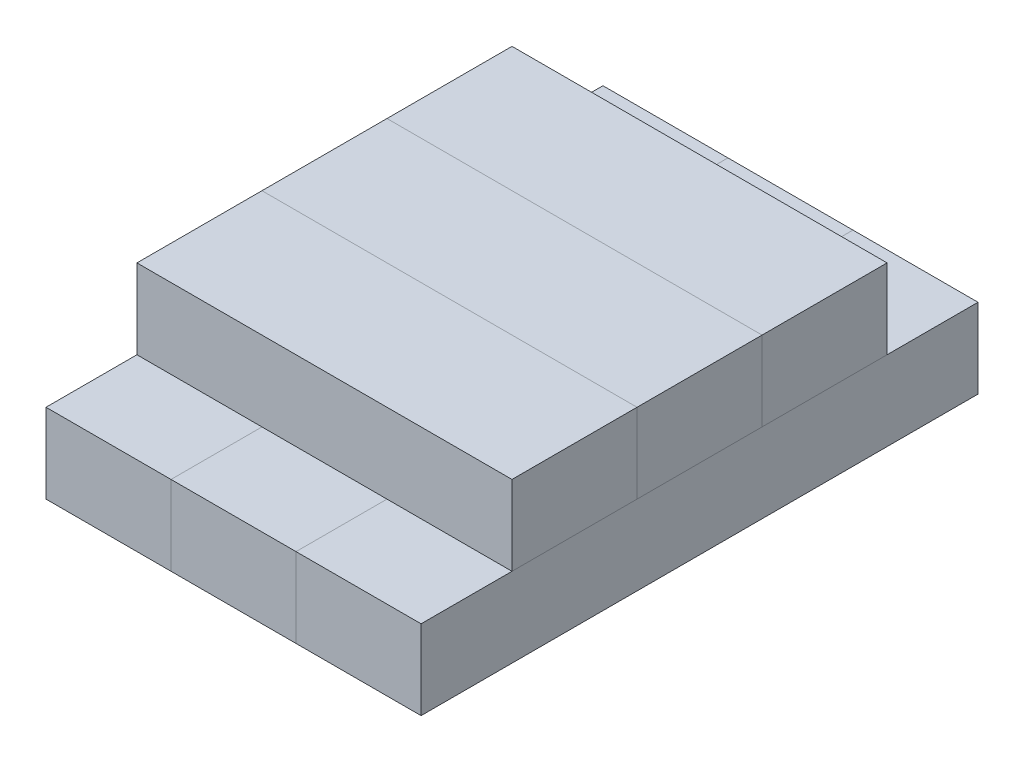
ISO-10303-21;
HEADER;
FILE_DESCRIPTION(('STEP AP214'),'2;1');
FILE_NAME('part.step','',(''),(''),'','','');
FILE_SCHEMA(('AUTOMOTIVE_DESIGN { 1 0 10303 214 1 1 1 1 }'));
ENDSEC;
DATA;
#1=APPLICATION_CONTEXT('core data for automotive mechanical design processes');
#2=APPLICATION_PROTOCOL_DEFINITION('international standard','automotive_design',2000,#1);
#3=PRODUCT_CONTEXT('',#1,'mechanical');
#4=PRODUCT('Part','Part','',(#3));
#5=PRODUCT_RELATED_PRODUCT_CATEGORY('part','',(#4));
#6=PRODUCT_DEFINITION_FORMATION('','',#4);
#7=PRODUCT_DEFINITION_CONTEXT('part definition',#1,'design');
#8=PRODUCT_DEFINITION('design','',#6,#7);
#9=PRODUCT_DEFINITION_SHAPE('','',#8);
#10=(LENGTH_UNIT() NAMED_UNIT(*) SI_UNIT(.MILLI.,.METRE.));
#11=(NAMED_UNIT(*) PLANE_ANGLE_UNIT() SI_UNIT($,.RADIAN.));
#12=(NAMED_UNIT(*) SI_UNIT($,.STERADIAN.) SOLID_ANGLE_UNIT());
#13=UNCERTAINTY_MEASURE_WITH_UNIT(LENGTH_MEASURE(1.E-05),#10,'distance_accuracy_value','');
#14=(GEOMETRIC_REPRESENTATION_CONTEXT(3) GLOBAL_UNCERTAINTY_ASSIGNED_CONTEXT((#13)) GLOBAL_UNIT_ASSIGNED_CONTEXT((#10,
#11,#12)) REPRESENTATION_CONTEXT('',''));
#15=CARTESIAN_POINT('',(0.,0.,0.));
#16=DIRECTION('',(0.,0.,1.));
#17=DIRECTION('',(1.,0.,0.));
#18=AXIS2_PLACEMENT_3D('',#15,#16,#17);
#19=CARTESIAN_POINT('',(0.,0.,-279.4));
#20=DIRECTION('',(-1.,0.,0.));
#21=DIRECTION('',(0.,0.,1.));
#22=AXIS2_PLACEMENT_3D('',#19,#20,#21);
#23=PLANE('',#22);
#24=DIRECTION('',(0.,-1.,0.));
#25=VECTOR('',#24,1.);
#26=CARTESIAN_POINT('',(0.,88.9,241.3));
#27=LINE('',#26,#25);
#28=CARTESIAN_POINT('',(0.,177.8,241.3));
#29=VERTEX_POINT('',#28);
#30=CARTESIAN_POINT('',(0.,88.9,241.3));
#31=VERTEX_POINT('',#30);
#32=EDGE_CURVE('E116',#29,#31,#27,.T.);
#33=ORIENTED_EDGE('',*,*,#32,.F.);
#34=DIRECTION('',(0.,0.,1.));
#35=VECTOR('',#34,1.);
#36=CARTESIAN_POINT('',(0.,177.8,241.3));
#37=LINE('',#36,#35);
#38=CARTESIAN_POINT('',(0.,177.8,101.6));
#39=VERTEX_POINT('',#38);
#40=EDGE_CURVE('E131',#39,#29,#37,.T.);
#41=ORIENTED_EDGE('',*,*,#40,.F.);
#42=DIRECTION('',(0.,1.,0.));
#43=VECTOR('',#42,1.);
#44=CARTESIAN_POINT('',(0.,88.9,101.6));
#45=LINE('',#44,#43);
#46=CARTESIAN_POINT('',(0.,88.9,101.6));
#47=VERTEX_POINT('',#46);
#48=EDGE_CURVE('E118',#47,#39,#45,.T.);
#49=ORIENTED_EDGE('',*,*,#48,.F.);
#50=DIRECTION('',(0.,0.,-1.));
#51=VECTOR('',#50,1.);
#52=CARTESIAN_POINT('',(0.,88.9,241.3));
#53=LINE('',#52,#51);
#54=EDGE_CURVE('E107',#31,#47,#53,.T.);
#55=ORIENTED_EDGE('',*,*,#54,.F.);
#56=EDGE_LOOP('',(#33,#41,#49,#55));
#57=FACE_BOUND('',#56,.T.);
#58=ADVANCED_FACE('F56',(#57),#23,.T.);
#59=CARTESIAN_POINT('',(584.687741092147,177.8,241.3));
#60=DIRECTION('',(0.,-1.,0.));
#61=DIRECTION('',(0.,0.,-1.));
#62=AXIS2_PLACEMENT_3D('',#59,#60,#61);
#63=PLANE('',#62);
#64=DIRECTION('',(-1.,0.,0.));
#65=VECTOR('',#64,1.);
#66=CARTESIAN_POINT('',(584.687741092147,177.8,241.3));
#67=LINE('',#66,#65);
#68=CARTESIAN_POINT('',(419.1,177.8,241.3));
#69=VERTEX_POINT('',#68);
#70=EDGE_CURVE('E122',#69,#29,#67,.T.);
#71=ORIENTED_EDGE('',*,*,#70,.F.);
#72=DIRECTION('',(0.,0.,-1.));
#73=VECTOR('',#72,1.);
#74=CARTESIAN_POINT('',(419.1,177.8,241.3));
#75=LINE('',#74,#73);
#76=CARTESIAN_POINT('',(419.1,177.8,101.6));
#77=VERTEX_POINT('',#76);
#78=EDGE_CURVE('E60',#69,#77,#75,.T.);
#79=ORIENTED_EDGE('',*,*,#78,.T.);
#80=DIRECTION('',(-1.,0.,0.));
#81=VECTOR('',#80,1.);
#82=CARTESIAN_POINT('',(584.687741092147,177.8,101.6));
#83=LINE('',#82,#81);
#84=EDGE_CURVE('E135',#77,#39,#83,.T.);
#85=ORIENTED_EDGE('',*,*,#84,.T.);
#86=ORIENTED_EDGE('',*,*,#40,.T.);
#87=EDGE_LOOP('',(#71,#79,#85,#86));
#88=FACE_BOUND('',#87,.T.);
#89=ADVANCED_FACE('F149',(#88),#63,.F.);
#90=CARTESIAN_POINT('',(584.687741092147,88.9,101.6));
#91=DIRECTION('',(0.,0.,1.));
#92=DIRECTION('',(1.,0.,0.));
#93=AXIS2_PLACEMENT_3D('',#90,#91,#92);
#94=PLANE('',#93);
#95=ORIENTED_EDGE('',*,*,#84,.F.);
#96=DIRECTION('',(0.,-1.,0.));
#97=VECTOR('',#96,1.);
#98=CARTESIAN_POINT('',(419.1,88.9,101.6));
#99=LINE('',#98,#97);
#100=CARTESIAN_POINT('',(419.1,88.9,101.6));
#101=VERTEX_POINT('',#100);
#102=EDGE_CURVE('E143',#77,#101,#99,.T.);
#103=ORIENTED_EDGE('',*,*,#102,.T.);
#104=DIRECTION('',(-1.,0.,0.));
#105=VECTOR('',#104,1.);
#106=CARTESIAN_POINT('',(584.687741092147,88.9,101.6));
#107=LINE('',#106,#105);
#108=EDGE_CURVE('E112',#101,#47,#107,.T.);
#109=ORIENTED_EDGE('',*,*,#108,.T.);
#110=ORIENTED_EDGE('',*,*,#48,.T.);
#111=EDGE_LOOP('',(#95,#103,#109,#110));
#112=FACE_BOUND('',#111,.T.);
#113=ADVANCED_FACE('F142',(#112),#94,.F.);
#114=CARTESIAN_POINT('',(584.687741092147,88.9,241.3));
#115=DIRECTION('',(0.,1.,0.));
#116=DIRECTION('',(0.,0.,1.));
#117=AXIS2_PLACEMENT_3D('',#114,#115,#116);
#118=PLANE('',#117);
#119=ORIENTED_EDGE('',*,*,#108,.F.);
#120=DIRECTION('',(0.,0.,1.));
#121=VECTOR('',#120,1.);
#122=CARTESIAN_POINT('',(419.1,88.9,241.3));
#123=LINE('',#122,#121);
#124=CARTESIAN_POINT('',(419.1,88.9,241.3));
#125=VERTEX_POINT('',#124);
#126=EDGE_CURVE('E66',#101,#125,#123,.T.);
#127=ORIENTED_EDGE('',*,*,#126,.T.);
#128=DIRECTION('',(-1.,0.,0.));
#129=VECTOR('',#128,1.);
#130=CARTESIAN_POINT('',(584.687741092147,88.9,241.3));
#131=LINE('',#130,#129);
#132=EDGE_CURVE('E104',#125,#31,#131,.T.);
#133=ORIENTED_EDGE('',*,*,#132,.T.);
#134=ORIENTED_EDGE('',*,*,#54,.T.);
#135=EDGE_LOOP('',(#119,#127,#133,#134));
#136=FACE_BOUND('',#135,.T.);
#137=ADVANCED_FACE('F106',(#136),#118,.F.);
#138=CARTESIAN_POINT('',(584.687741092147,88.9,241.3));
#139=DIRECTION('',(0.,0.,-1.));
#140=DIRECTION('',(-1.,0.,0.));
#141=AXIS2_PLACEMENT_3D('',#138,#139,#140);
#142=PLANE('',#141);
#143=ORIENTED_EDGE('',*,*,#132,.F.);
#144=DIRECTION('',(0.,1.,0.));
#145=VECTOR('',#144,1.);
#146=CARTESIAN_POINT('',(419.1,88.9,241.3));
#147=LINE('',#146,#145);
#148=EDGE_CURVE('E12',#125,#69,#147,.T.);
#149=ORIENTED_EDGE('',*,*,#148,.T.);
#150=ORIENTED_EDGE('',*,*,#70,.T.);
#151=ORIENTED_EDGE('',*,*,#32,.T.);
#152=EDGE_LOOP('',(#143,#149,#150,#151));
#153=FACE_BOUND('',#152,.T.);
#154=ADVANCED_FACE('F58',(#153),#142,.F.);
#155=CARTESIAN_POINT('',(419.1,0.,622.3));
#156=DIRECTION('',(-1.,0.,0.));
#157=DIRECTION('',(0.,0.,1.));
#158=AXIS2_PLACEMENT_3D('',#155,#156,#157);
#159=PLANE('',#158);
#160=ORIENTED_EDGE('',*,*,#126,.F.);
#161=ORIENTED_EDGE('',*,*,#102,.F.);
#162=ORIENTED_EDGE('',*,*,#78,.F.);
#163=ORIENTED_EDGE('',*,*,#148,.F.);
#164=EDGE_LOOP('',(#160,#161,#162,#163));
#165=FACE_BOUND('',#164,.T.);
#166=ADVANCED_FACE('F163',(#165),#159,.F.);
#167=CLOSED_SHELL('',(#58,#89,#113,#137,#154,#166));
#168=MANIFOLD_SOLID_BREP('B2',#167);
#169=CARTESIAN_POINT('',(0.,0.,-139.7));
#170=DIRECTION('',(-1.,0.,0.));
#171=DIRECTION('',(0.,0.,1.));
#172=AXIS2_PLACEMENT_3D('',#169,#170,#171);
#173=PLANE('',#172);
#174=DIRECTION('',(0.,-1.,0.));
#175=VECTOR('',#174,1.);
#176=CARTESIAN_POINT('',(0.,88.9,381.));
#177=LINE('',#176,#175);
#178=CARTESIAN_POINT('',(0.,177.8,381.));
#179=VERTEX_POINT('',#178);
#180=CARTESIAN_POINT('',(0.,88.9,381.));
#181=VERTEX_POINT('',#180);
#182=EDGE_CURVE('E284',#179,#181,#177,.T.);
#183=ORIENTED_EDGE('',*,*,#182,.F.);
#184=DIRECTION('',(0.,0.,1.));
#185=VECTOR('',#184,1.);
#186=CARTESIAN_POINT('',(0.,177.8,381.));
#187=LINE('',#186,#185);
#188=CARTESIAN_POINT('',(0.,177.8,241.3));
#189=VERTEX_POINT('',#188);
#190=EDGE_CURVE('E300',#189,#179,#187,.T.);
#191=ORIENTED_EDGE('',*,*,#190,.F.);
#192=DIRECTION('',(0.,1.,0.));
#193=VECTOR('',#192,1.);
#194=CARTESIAN_POINT('',(0.,88.9,241.3));
#195=LINE('',#194,#193);
#196=CARTESIAN_POINT('',(0.,88.9,241.3));
#197=VERTEX_POINT('',#196);
#198=EDGE_CURVE('E286',#197,#189,#195,.T.);
#199=ORIENTED_EDGE('',*,*,#198,.F.);
#200=DIRECTION('',(0.,0.,-1.));
#201=VECTOR('',#200,1.);
#202=CARTESIAN_POINT('',(0.,88.9,381.));
#203=LINE('',#202,#201);
#204=EDGE_CURVE('E275',#181,#197,#203,.T.);
#205=ORIENTED_EDGE('',*,*,#204,.F.);
#206=EDGE_LOOP('',(#183,#191,#199,#205));
#207=FACE_BOUND('',#206,.T.);
#208=ADVANCED_FACE('F224',(#207),#173,.T.);
#209=CARTESIAN_POINT('',(584.687741092147,177.8,381.));
#210=DIRECTION('',(0.,-1.,0.));
#211=DIRECTION('',(0.,0.,-1.));
#212=AXIS2_PLACEMENT_3D('',#209,#210,#211);
#213=PLANE('',#212);
#214=DIRECTION('',(-1.,0.,0.));
#215=VECTOR('',#214,1.);
#216=CARTESIAN_POINT('',(584.687741092147,177.8,381.));
#217=LINE('',#216,#215);
#218=CARTESIAN_POINT('',(419.1,177.8,381.));
#219=VERTEX_POINT('',#218);
#220=EDGE_CURVE('E290',#219,#179,#217,.T.);
#221=ORIENTED_EDGE('',*,*,#220,.F.);
#222=DIRECTION('',(0.,0.,-1.));
#223=VECTOR('',#222,1.);
#224=CARTESIAN_POINT('',(419.1,177.8,381.));
#225=LINE('',#224,#223);
#226=CARTESIAN_POINT('',(419.1,177.8,241.3));
#227=VERTEX_POINT('',#226);
#228=EDGE_CURVE('E228',#219,#227,#225,.T.);
#229=ORIENTED_EDGE('',*,*,#228,.T.);
#230=DIRECTION('',(-1.,0.,0.));
#231=VECTOR('',#230,1.);
#232=CARTESIAN_POINT('',(584.687741092147,177.8,241.3));
#233=LINE('',#232,#231);
#234=EDGE_CURVE('E304',#227,#189,#233,.T.);
#235=ORIENTED_EDGE('',*,*,#234,.T.);
#236=ORIENTED_EDGE('',*,*,#190,.T.);
#237=EDGE_LOOP('',(#221,#229,#235,#236));
#238=FACE_BOUND('',#237,.T.);
#239=ADVANCED_FACE('F317',(#238),#213,.F.);
#240=CARTESIAN_POINT('',(584.687741092147,88.9,241.3));
#241=DIRECTION('',(0.,0.,1.));
#242=DIRECTION('',(1.,0.,0.));
#243=AXIS2_PLACEMENT_3D('',#240,#241,#242);
#244=PLANE('',#243);
#245=ORIENTED_EDGE('',*,*,#234,.F.);
#246=DIRECTION('',(0.,-1.,0.));
#247=VECTOR('',#246,1.);
#248=CARTESIAN_POINT('',(419.1,88.9,241.3));
#249=LINE('',#248,#247);
#250=CARTESIAN_POINT('',(419.1,88.9,241.3));
#251=VERTEX_POINT('',#250);
#252=EDGE_CURVE('E311',#227,#251,#249,.T.);
#253=ORIENTED_EDGE('',*,*,#252,.T.);
#254=DIRECTION('',(-1.,0.,0.));
#255=VECTOR('',#254,1.);
#256=CARTESIAN_POINT('',(584.687741092147,88.9,241.3));
#257=LINE('',#256,#255);
#258=EDGE_CURVE('E280',#251,#197,#257,.T.);
#259=ORIENTED_EDGE('',*,*,#258,.T.);
#260=ORIENTED_EDGE('',*,*,#198,.T.);
#261=EDGE_LOOP('',(#245,#253,#259,#260));
#262=FACE_BOUND('',#261,.T.);
#263=ADVANCED_FACE('F310',(#262),#244,.F.);
#264=CARTESIAN_POINT('',(584.687741092147,88.9,381.));
#265=DIRECTION('',(0.,1.,0.));
#266=DIRECTION('',(0.,0.,1.));
#267=AXIS2_PLACEMENT_3D('',#264,#265,#266);
#268=PLANE('',#267);
#269=ORIENTED_EDGE('',*,*,#258,.F.);
#270=DIRECTION('',(0.,0.,1.));
#271=VECTOR('',#270,1.);
#272=CARTESIAN_POINT('',(419.1,88.9,381.));
#273=LINE('',#272,#271);
#274=CARTESIAN_POINT('',(419.1,88.9,381.));
#275=VERTEX_POINT('',#274);
#276=EDGE_CURVE('E234',#251,#275,#273,.T.);
#277=ORIENTED_EDGE('',*,*,#276,.T.);
#278=DIRECTION('',(-1.,0.,0.));
#279=VECTOR('',#278,1.);
#280=CARTESIAN_POINT('',(584.687741092147,88.9,381.));
#281=LINE('',#280,#279);
#282=EDGE_CURVE('E272',#275,#181,#281,.T.);
#283=ORIENTED_EDGE('',*,*,#282,.T.);
#284=ORIENTED_EDGE('',*,*,#204,.T.);
#285=EDGE_LOOP('',(#269,#277,#283,#284));
#286=FACE_BOUND('',#285,.T.);
#287=ADVANCED_FACE('F274',(#286),#268,.F.);
#288=CARTESIAN_POINT('',(584.687741092147,88.9,381.));
#289=DIRECTION('',(0.,0.,-1.));
#290=DIRECTION('',(-1.,0.,0.));
#291=AXIS2_PLACEMENT_3D('',#288,#289,#290);
#292=PLANE('',#291);
#293=ORIENTED_EDGE('',*,*,#282,.F.);
#294=DIRECTION('',(0.,1.,0.));
#295=VECTOR('',#294,1.);
#296=CARTESIAN_POINT('',(419.1,88.9,381.));
#297=LINE('',#296,#295);
#298=EDGE_CURVE('E54',#275,#219,#297,.T.);
#299=ORIENTED_EDGE('',*,*,#298,.T.);
#300=ORIENTED_EDGE('',*,*,#220,.T.);
#301=ORIENTED_EDGE('',*,*,#182,.T.);
#302=EDGE_LOOP('',(#293,#299,#300,#301));
#303=FACE_BOUND('',#302,.T.);
#304=ADVANCED_FACE('F226',(#303),#292,.F.);
#305=CARTESIAN_POINT('',(419.1,0.,622.3));
#306=DIRECTION('',(-1.,0.,0.));
#307=DIRECTION('',(0.,0.,1.));
#308=AXIS2_PLACEMENT_3D('',#305,#306,#307);
#309=PLANE('',#308);
#310=ORIENTED_EDGE('',*,*,#276,.F.);
#311=ORIENTED_EDGE('',*,*,#252,.F.);
#312=ORIENTED_EDGE('',*,*,#228,.F.);
#313=ORIENTED_EDGE('',*,*,#298,.F.);
#314=EDGE_LOOP('',(#310,#311,#312,#313));
#315=FACE_BOUND('',#314,.T.);
#316=ADVANCED_FACE('F331',(#315),#309,.F.);
#317=CLOSED_SHELL('',(#208,#239,#263,#287,#304,#316));
#318=MANIFOLD_SOLID_BREP('B6',#317);
#319=CARTESIAN_POINT('',(0.,0.,0.));
#320=DIRECTION('',(-1.,0.,0.));
#321=DIRECTION('',(0.,0.,1.));
#322=AXIS2_PLACEMENT_3D('',#319,#320,#321);
#323=PLANE('',#322);
#324=DIRECTION('',(0.,-1.,0.));
#325=VECTOR('',#324,1.);
#326=CARTESIAN_POINT('',(0.,88.9,520.7));
#327=LINE('',#326,#325);
#328=CARTESIAN_POINT('',(0.,177.8,520.7));
#329=VERTEX_POINT('',#328);
#330=CARTESIAN_POINT('',(0.,88.9,520.7));
#331=VERTEX_POINT('',#330);
#332=EDGE_CURVE('E453',#329,#331,#327,.T.);
#333=ORIENTED_EDGE('',*,*,#332,.F.);
#334=DIRECTION('',(0.,0.,1.));
#335=VECTOR('',#334,1.);
#336=CARTESIAN_POINT('',(0.,177.8,520.7));
#337=LINE('',#336,#335);
#338=CARTESIAN_POINT('',(0.,177.8,381.));
#339=VERTEX_POINT('',#338);
#340=EDGE_CURVE('E467',#339,#329,#337,.T.);
#341=ORIENTED_EDGE('',*,*,#340,.F.);
#342=DIRECTION('',(0.,1.,0.));
#343=VECTOR('',#342,1.);
#344=CARTESIAN_POINT('',(0.,88.9,381.));
#345=LINE('',#344,#343);
#346=CARTESIAN_POINT('',(0.,88.9,381.));
#347=VERTEX_POINT('',#346);
#348=EDGE_CURVE('E455',#347,#339,#345,.T.);
#349=ORIENTED_EDGE('',*,*,#348,.F.);
#350=DIRECTION('',(0.,0.,-1.));
#351=VECTOR('',#350,1.);
#352=CARTESIAN_POINT('',(0.,88.9,520.7));
#353=LINE('',#352,#351);
#354=EDGE_CURVE('E444',#331,#347,#353,.T.);
#355=ORIENTED_EDGE('',*,*,#354,.F.);
#356=EDGE_LOOP('',(#333,#341,#349,#355));
#357=FACE_BOUND('',#356,.T.);
#358=ADVANCED_FACE('F393',(#357),#323,.T.);
#359=CARTESIAN_POINT('',(584.687741092147,177.8,520.7));
#360=DIRECTION('',(0.,-1.,0.));
#361=DIRECTION('',(0.,0.,-1.));
#362=AXIS2_PLACEMENT_3D('',#359,#360,#361);
#363=PLANE('',#362);
#364=DIRECTION('',(-1.,0.,0.));
#365=VECTOR('',#364,1.);
#366=CARTESIAN_POINT('',(584.687741092147,177.8,520.7));
#367=LINE('',#366,#365);
#368=CARTESIAN_POINT('',(419.1,177.8,520.7));
#369=VERTEX_POINT('',#368);
#370=EDGE_CURVE('E459',#369,#329,#367,.T.);
#371=ORIENTED_EDGE('',*,*,#370,.F.);
#372=DIRECTION('',(0.,0.,-1.));
#373=VECTOR('',#372,1.);
#374=CARTESIAN_POINT('',(419.1,177.8,520.7));
#375=LINE('',#374,#373);
#376=CARTESIAN_POINT('',(419.1,177.8,381.));
#377=VERTEX_POINT('',#376);
#378=EDGE_CURVE('E397',#369,#377,#375,.T.);
#379=ORIENTED_EDGE('',*,*,#378,.T.);
#380=DIRECTION('',(-1.,0.,0.));
#381=VECTOR('',#380,1.);
#382=CARTESIAN_POINT('',(584.687741092147,177.8,381.));
#383=LINE('',#382,#381);
#384=EDGE_CURVE('E472',#377,#339,#383,.T.);
#385=ORIENTED_EDGE('',*,*,#384,.T.);
#386=ORIENTED_EDGE('',*,*,#340,.T.);
#387=EDGE_LOOP('',(#371,#379,#385,#386));
#388=FACE_BOUND('',#387,.T.);
#389=ADVANCED_FACE('F486',(#388),#363,.F.);
#390=CARTESIAN_POINT('',(584.687741092147,88.9,381.));
#391=DIRECTION('',(0.,0.,1.));
#392=DIRECTION('',(1.,0.,0.));
#393=AXIS2_PLACEMENT_3D('',#390,#391,#392);
#394=PLANE('',#393);
#395=ORIENTED_EDGE('',*,*,#384,.F.);
#396=DIRECTION('',(0.,-1.,0.));
#397=VECTOR('',#396,1.);
#398=CARTESIAN_POINT('',(419.1,88.9,381.));
#399=LINE('',#398,#397);
#400=CARTESIAN_POINT('',(419.1,88.9,381.));
#401=VERTEX_POINT('',#400);
#402=EDGE_CURVE('E481',#377,#401,#399,.T.);
#403=ORIENTED_EDGE('',*,*,#402,.T.);
#404=DIRECTION('',(-1.,0.,0.));
#405=VECTOR('',#404,1.);
#406=CARTESIAN_POINT('',(584.687741092147,88.9,381.));
#407=LINE('',#406,#405);
#408=EDGE_CURVE('E449',#401,#347,#407,.T.);
#409=ORIENTED_EDGE('',*,*,#408,.T.);
#410=ORIENTED_EDGE('',*,*,#348,.T.);
#411=EDGE_LOOP('',(#395,#403,#409,#410));
#412=FACE_BOUND('',#411,.T.);
#413=ADVANCED_FACE('F480',(#412),#394,.F.);
#414=CARTESIAN_POINT('',(584.687741092147,88.9,520.7));
#415=DIRECTION('',(0.,1.,0.));
#416=DIRECTION('',(0.,0.,1.));
#417=AXIS2_PLACEMENT_3D('',#414,#415,#416);
#418=PLANE('',#417);
#419=ORIENTED_EDGE('',*,*,#408,.F.);
#420=DIRECTION('',(0.,0.,1.));
#421=VECTOR('',#420,1.);
#422=CARTESIAN_POINT('',(419.1,88.9,520.7));
#423=LINE('',#422,#421);
#424=CARTESIAN_POINT('',(419.1,88.9,520.7));
#425=VERTEX_POINT('',#424);
#426=EDGE_CURVE('E403',#401,#425,#423,.T.);
#427=ORIENTED_EDGE('',*,*,#426,.T.);
#428=DIRECTION('',(-1.,0.,0.));
#429=VECTOR('',#428,1.);
#430=CARTESIAN_POINT('',(584.687741092147,88.9,520.7));
#431=LINE('',#430,#429);
#432=EDGE_CURVE('E441',#425,#331,#431,.T.);
#433=ORIENTED_EDGE('',*,*,#432,.T.);
#434=ORIENTED_EDGE('',*,*,#354,.T.);
#435=EDGE_LOOP('',(#419,#427,#433,#434));
#436=FACE_BOUND('',#435,.T.);
#437=ADVANCED_FACE('F443',(#436),#418,.F.);
#438=CARTESIAN_POINT('',(584.687741092147,88.9,520.7));
#439=DIRECTION('',(0.,0.,-1.));
#440=DIRECTION('',(-1.,0.,0.));
#441=AXIS2_PLACEMENT_3D('',#438,#439,#440);
#442=PLANE('',#441);
#443=ORIENTED_EDGE('',*,*,#432,.F.);
#444=DIRECTION('',(0.,1.,0.));
#445=VECTOR('',#444,1.);
#446=CARTESIAN_POINT('',(419.1,88.9,520.7));
#447=LINE('',#446,#445);
#448=EDGE_CURVE('E222',#425,#369,#447,.T.);
#449=ORIENTED_EDGE('',*,*,#448,.T.);
#450=ORIENTED_EDGE('',*,*,#370,.T.);
#451=ORIENTED_EDGE('',*,*,#332,.T.);
#452=EDGE_LOOP('',(#443,#449,#450,#451));
#453=FACE_BOUND('',#452,.T.);
#454=ADVANCED_FACE('F395',(#453),#442,.F.);
#455=CARTESIAN_POINT('',(419.1,0.,622.3));
#456=DIRECTION('',(-1.,0.,0.));
#457=DIRECTION('',(0.,0.,1.));
#458=AXIS2_PLACEMENT_3D('',#455,#456,#457);
#459=PLANE('',#458);
#460=ORIENTED_EDGE('',*,*,#426,.F.);
#461=ORIENTED_EDGE('',*,*,#402,.F.);
#462=ORIENTED_EDGE('',*,*,#378,.F.);
#463=ORIENTED_EDGE('',*,*,#448,.F.);
#464=EDGE_LOOP('',(#460,#461,#462,#463));
#465=FACE_BOUND('',#464,.T.);
#466=ADVANCED_FACE('F500',(#465),#459,.F.);
#467=CLOSED_SHELL('',(#358,#389,#413,#437,#454,#466));
#468=MANIFOLD_SOLID_BREP('B48',#467);
#469=CARTESIAN_POINT('',(0.,0.,622.3));
#470=DIRECTION('',(0.,0.,1.));
#471=DIRECTION('',(1.,0.,0.));
#472=AXIS2_PLACEMENT_3D('',#469,#470,#471);
#473=PLANE('',#472);
#474=DIRECTION('',(0.,1.,0.));
#475=VECTOR('',#474,1.);
#476=CARTESIAN_POINT('',(139.7,0.,622.3));
#477=LINE('',#476,#475);
#478=CARTESIAN_POINT('',(139.7,0.,622.3));
#479=VERTEX_POINT('',#478);
#480=CARTESIAN_POINT('',(139.7,88.9,622.3));
#481=VERTEX_POINT('',#480);
#482=EDGE_CURVE('E613',#479,#481,#477,.T.);
#483=ORIENTED_EDGE('',*,*,#482,.F.);
#484=DIRECTION('',(1.,0.,0.));
#485=VECTOR('',#484,1.);
#486=CARTESIAN_POINT('',(0.,0.,622.3));
#487=LINE('',#486,#485);
#488=CARTESIAN_POINT('',(279.4,0.,622.3));
#489=VERTEX_POINT('',#488);
#490=EDGE_CURVE('E637',#479,#489,#487,.T.);
#491=ORIENTED_EDGE('',*,*,#490,.T.);
#492=DIRECTION('',(0.,1.,0.));
#493=VECTOR('',#492,1.);
#494=CARTESIAN_POINT('',(279.4,0.,622.3));
#495=LINE('',#494,#493);
#496=CARTESIAN_POINT('',(279.4,88.9,622.3));
#497=VERTEX_POINT('',#496);
#498=EDGE_CURVE('E605',#489,#497,#495,.T.);
#499=ORIENTED_EDGE('',*,*,#498,.T.);
#500=DIRECTION('',(1.,0.,0.));
#501=VECTOR('',#500,1.);
#502=CARTESIAN_POINT('',(0.,88.9,622.3));
#503=LINE('',#502,#501);
#504=EDGE_CURVE('E610',#481,#497,#503,.T.);
#505=ORIENTED_EDGE('',*,*,#504,.F.);
#506=EDGE_LOOP('',(#483,#491,#499,#505));
#507=FACE_BOUND('',#506,.T.);
#508=ADVANCED_FACE('F562',(#507),#473,.T.);
#509=CARTESIAN_POINT('',(0.,0.,0.));
#510=DIRECTION('',(0.,0.,1.));
#511=DIRECTION('',(1.,0.,0.));
#512=AXIS2_PLACEMENT_3D('',#509,#510,#511);
#513=PLANE('',#512);
#514=DIRECTION('',(1.,0.,0.));
#515=VECTOR('',#514,1.);
#516=CARTESIAN_POINT('',(0.,0.,0.));
#517=LINE('',#516,#515);
#518=CARTESIAN_POINT('',(139.7,0.,0.));
#519=VERTEX_POINT('',#518);
#520=CARTESIAN_POINT('',(279.4,0.,0.));
#521=VERTEX_POINT('',#520);
#522=EDGE_CURVE('E391',#519,#521,#517,.T.);
#523=ORIENTED_EDGE('',*,*,#522,.F.);
#524=DIRECTION('',(0.,1.,0.));
#525=VECTOR('',#524,1.);
#526=CARTESIAN_POINT('',(139.7,0.,0.));
#527=LINE('',#526,#525);
#528=CARTESIAN_POINT('',(139.7,88.9,0.));
#529=VERTEX_POINT('',#528);
#530=EDGE_CURVE('E633',#519,#529,#527,.T.);
#531=ORIENTED_EDGE('',*,*,#530,.T.);
#532=DIRECTION('',(1.,0.,0.));
#533=VECTOR('',#532,1.);
#534=CARTESIAN_POINT('',(0.,88.9,0.));
#535=LINE('',#534,#533);
#536=CARTESIAN_POINT('',(279.4,88.9,0.));
#537=VERTEX_POINT('',#536);
#538=EDGE_CURVE('E622',#529,#537,#535,.T.);
#539=ORIENTED_EDGE('',*,*,#538,.T.);
#540=DIRECTION('',(0.,1.,0.));
#541=VECTOR('',#540,1.);
#542=CARTESIAN_POINT('',(279.4,0.,0.));
#543=LINE('',#542,#541);
#544=EDGE_CURVE('E645',#521,#537,#543,.T.);
#545=ORIENTED_EDGE('',*,*,#544,.F.);
#546=EDGE_LOOP('',(#523,#531,#539,#545));
#547=FACE_BOUND('',#546,.T.);
#548=ADVANCED_FACE('F654',(#547),#513,.F.);
#549=CARTESIAN_POINT('',(139.7,0.,787.887741092147));
#550=DIRECTION('',(-1.,0.,0.));
#551=DIRECTION('',(0.,0.,1.));
#552=AXIS2_PLACEMENT_3D('',#549,#550,#551);
#553=PLANE('',#552);
#554=DIRECTION('',(0.,0.,-1.));
#555=VECTOR('',#554,1.);
#556=CARTESIAN_POINT('',(139.7,0.,787.887741092147));
#557=LINE('',#556,#555);
#558=EDGE_CURVE('E565',#479,#519,#557,.T.);
#559=ORIENTED_EDGE('',*,*,#558,.F.);
#560=ORIENTED_EDGE('',*,*,#482,.T.);
#561=DIRECTION('',(0.,0.,-1.));
#562=VECTOR('',#561,1.);
#563=CARTESIAN_POINT('',(139.7,88.9,787.887741092147));
#564=LINE('',#563,#562);
#565=EDGE_CURVE('E617',#481,#529,#564,.T.);
#566=ORIENTED_EDGE('',*,*,#565,.T.);
#567=ORIENTED_EDGE('',*,*,#530,.F.);
#568=EDGE_LOOP('',(#559,#560,#566,#567));
#569=FACE_BOUND('',#568,.T.);
#570=ADVANCED_FACE('F627',(#569),#553,.T.);
#571=CARTESIAN_POINT('',(0.,88.9,787.887741092147));
#572=DIRECTION('',(0.,1.,0.));
#573=DIRECTION('',(0.,0.,1.));
#574=AXIS2_PLACEMENT_3D('',#571,#572,#573);
#575=PLANE('',#574);
#576=ORIENTED_EDGE('',*,*,#565,.F.);
#577=ORIENTED_EDGE('',*,*,#504,.T.);
#578=DIRECTION('',(0.,0.,-1.));
#579=VECTOR('',#578,1.);
#580=CARTESIAN_POINT('',(279.4,88.9,787.887741092147));
#581=LINE('',#580,#579);
#582=EDGE_CURVE('E616',#497,#537,#581,.T.);
#583=ORIENTED_EDGE('',*,*,#582,.T.);
#584=ORIENTED_EDGE('',*,*,#538,.F.);
#585=EDGE_LOOP('',(#576,#577,#583,#584));
#586=FACE_BOUND('',#585,.T.);
#587=ADVANCED_FACE('F620',(#586),#575,.T.);
#588=CARTESIAN_POINT('',(279.4,0.,787.887741092147));
#589=DIRECTION('',(-1.,0.,0.));
#590=DIRECTION('',(0.,0.,1.));
#591=AXIS2_PLACEMENT_3D('',#588,#589,#590);
#592=PLANE('',#591);
#593=ORIENTED_EDGE('',*,*,#498,.F.);
#594=DIRECTION('',(0.,0.,-1.));
#595=VECTOR('',#594,1.);
#596=CARTESIAN_POINT('',(279.4,0.,787.887741092147));
#597=LINE('',#596,#595);
#598=EDGE_CURVE('E642',#489,#521,#597,.T.);
#599=ORIENTED_EDGE('',*,*,#598,.T.);
#600=ORIENTED_EDGE('',*,*,#544,.T.);
#601=ORIENTED_EDGE('',*,*,#582,.F.);
#602=EDGE_LOOP('',(#593,#599,#600,#601));
#603=FACE_BOUND('',#602,.T.);
#604=ADVANCED_FACE('F650',(#603),#592,.F.);
#605=CARTESIAN_POINT('',(0.,0.,787.887741092147));
#606=DIRECTION('',(0.,1.,0.));
#607=DIRECTION('',(0.,0.,1.));
#608=AXIS2_PLACEMENT_3D('',#605,#606,#607);
#609=PLANE('',#608);
#610=ORIENTED_EDGE('',*,*,#490,.F.);
#611=ORIENTED_EDGE('',*,*,#558,.T.);
#612=ORIENTED_EDGE('',*,*,#522,.T.);
#613=ORIENTED_EDGE('',*,*,#598,.F.);
#614=EDGE_LOOP('',(#610,#611,#612,#613));
#615=FACE_BOUND('',#614,.T.);
#616=ADVANCED_FACE('F656',(#615),#609,.F.);
#617=CLOSED_SHELL('',(#508,#548,#570,#587,#604,#616));
#618=MANIFOLD_SOLID_BREP('B216',#617);
#619=CARTESIAN_POINT('',(0.,0.,622.3));
#620=DIRECTION('',(0.,1.,0.));
#621=DIRECTION('',(0.,0.,1.));
#622=AXIS2_PLACEMENT_3D('',#619,#620,#621);
#623=PLANE('',#622);
#624=DIRECTION('',(1.,0.,0.));
#625=VECTOR('',#624,1.);
#626=CARTESIAN_POINT('',(0.,0.,0.));
#627=LINE('',#626,#625);
#628=CARTESIAN_POINT('',(279.4,0.,0.));
#629=VERTEX_POINT('',#628);
#630=CARTESIAN_POINT('',(419.1,0.,0.));
#631=VERTEX_POINT('',#630);
#632=EDGE_CURVE('E810',#629,#631,#627,.T.);
#633=ORIENTED_EDGE('',*,*,#632,.T.);
#634=DIRECTION('',(0.,0.,-1.));
#635=VECTOR('',#634,1.);
#636=CARTESIAN_POINT('',(419.1,0.,622.3));
#637=LINE('',#636,#635);
#638=CARTESIAN_POINT('',(419.1,0.,622.3));
#639=VERTEX_POINT('',#638);
#640=EDGE_CURVE('E560',#639,#631,#637,.T.);
#641=ORIENTED_EDGE('',*,*,#640,.F.);
#642=DIRECTION('',(1.,0.,0.));
#643=VECTOR('',#642,1.);
#644=CARTESIAN_POINT('',(0.,0.,622.3));
#645=LINE('',#644,#643);
#646=CARTESIAN_POINT('',(279.4,0.,622.3));
#647=VERTEX_POINT('',#646);
#648=EDGE_CURVE('E791',#647,#639,#645,.T.);
#649=ORIENTED_EDGE('',*,*,#648,.F.);
#650=DIRECTION('',(0.,0.,-1.));
#651=VECTOR('',#650,1.);
#652=CARTESIAN_POINT('',(279.4,0.,622.3));
#653=LINE('',#652,#651);
#654=EDGE_CURVE('E753',#647,#629,#653,.T.);
#655=ORIENTED_EDGE('',*,*,#654,.T.);
#656=EDGE_LOOP('',(#633,#641,#649,#655));
#657=FACE_BOUND('',#656,.T.);
#658=ADVANCED_FACE('F733',(#657),#623,.F.);
#659=CARTESIAN_POINT('',(419.1,0.,622.3));
#660=DIRECTION('',(-1.,0.,0.));
#661=DIRECTION('',(0.,0.,1.));
#662=AXIS2_PLACEMENT_3D('',#659,#660,#661);
#663=PLANE('',#662);
#664=DIRECTION('',(0.,1.,0.));
#665=VECTOR('',#664,1.);
#666=CARTESIAN_POINT('',(419.1,0.,0.));
#667=LINE('',#666,#665);
#668=CARTESIAN_POINT('',(419.1,88.9,0.));
#669=VERTEX_POINT('',#668);
#670=EDGE_CURVE('E797',#631,#669,#667,.T.);
#671=ORIENTED_EDGE('',*,*,#670,.T.);
#672=DIRECTION('',(0.,0.,-1.));
#673=VECTOR('',#672,1.);
#674=CARTESIAN_POINT('',(419.1,88.9,622.3));
#675=LINE('',#674,#673);
#676=CARTESIAN_POINT('',(419.1,88.9,622.3));
#677=VERTEX_POINT('',#676);
#678=EDGE_CURVE('E742',#677,#669,#675,.T.);
#679=ORIENTED_EDGE('',*,*,#678,.F.);
#680=DIRECTION('',(0.,1.,0.));
#681=VECTOR('',#680,1.);
#682=CARTESIAN_POINT('',(419.1,0.,622.3));
#683=LINE('',#682,#681);
#684=EDGE_CURVE('E783',#639,#677,#683,.T.);
#685=ORIENTED_EDGE('',*,*,#684,.F.);
#686=ORIENTED_EDGE('',*,*,#640,.T.);
#687=EDGE_LOOP('',(#671,#679,#685,#686));
#688=FACE_BOUND('',#687,.T.);
#689=ADVANCED_FACE('F796',(#688),#663,.F.);
#690=CARTESIAN_POINT('',(0.,88.9,622.3));
#691=DIRECTION('',(0.,1.,0.));
#692=DIRECTION('',(0.,0.,1.));
#693=AXIS2_PLACEMENT_3D('',#690,#691,#692);
#694=PLANE('',#693);
#695=DIRECTION('',(1.,0.,0.));
#696=VECTOR('',#695,1.);
#697=CARTESIAN_POINT('',(0.,88.9,0.));
#698=LINE('',#697,#696);
#699=CARTESIAN_POINT('',(279.4,88.9,0.));
#700=VERTEX_POINT('',#699);
#701=EDGE_CURVE('E815',#700,#669,#698,.T.);
#702=ORIENTED_EDGE('',*,*,#701,.F.);
#703=DIRECTION('',(0.,0.,-1.));
#704=VECTOR('',#703,1.);
#705=CARTESIAN_POINT('',(279.4,88.9,622.3));
#706=LINE('',#705,#704);
#707=CARTESIAN_POINT('',(279.4,88.9,622.3));
#708=VERTEX_POINT('',#707);
#709=EDGE_CURVE('E770',#708,#700,#706,.T.);
#710=ORIENTED_EDGE('',*,*,#709,.F.);
#711=DIRECTION('',(1.,0.,0.));
#712=VECTOR('',#711,1.);
#713=CARTESIAN_POINT('',(0.,88.9,622.3));
#714=LINE('',#713,#712);
#715=EDGE_CURVE('E790',#708,#677,#714,.T.);
#716=ORIENTED_EDGE('',*,*,#715,.T.);
#717=ORIENTED_EDGE('',*,*,#678,.T.);
#718=EDGE_LOOP('',(#702,#710,#716,#717));
#719=FACE_BOUND('',#718,.T.);
#720=ADVANCED_FACE('F801',(#719),#694,.T.);
#721=CARTESIAN_POINT('',(279.4,0.,622.3));
#722=DIRECTION('',(-1.,0.,0.));
#723=DIRECTION('',(0.,0.,1.));
#724=AXIS2_PLACEMENT_3D('',#721,#722,#723);
#725=PLANE('',#724);
#726=DIRECTION('',(0.,1.,0.));
#727=VECTOR('',#726,1.);
#728=CARTESIAN_POINT('',(279.4,0.,0.));
#729=LINE('',#728,#727);
#730=EDGE_CURVE('E818',#629,#700,#729,.T.);
#731=ORIENTED_EDGE('',*,*,#730,.F.);
#732=ORIENTED_EDGE('',*,*,#654,.F.);
#733=DIRECTION('',(0.,1.,0.));
#734=VECTOR('',#733,1.);
#735=CARTESIAN_POINT('',(279.4,0.,622.3));
#736=LINE('',#735,#734);
#737=EDGE_CURVE('E803',#647,#708,#736,.T.);
#738=ORIENTED_EDGE('',*,*,#737,.T.);
#739=ORIENTED_EDGE('',*,*,#709,.T.);
#740=EDGE_LOOP('',(#731,#732,#738,#739));
#741=FACE_BOUND('',#740,.T.);
#742=ADVANCED_FACE('F827',(#741),#725,.T.);
#743=CARTESIAN_POINT('',(0.,0.,622.3));
#744=DIRECTION('',(0.,0.,1.));
#745=DIRECTION('',(1.,0.,0.));
#746=AXIS2_PLACEMENT_3D('',#743,#744,#745);
#747=PLANE('',#746);
#748=ORIENTED_EDGE('',*,*,#648,.T.);
#749=ORIENTED_EDGE('',*,*,#684,.T.);
#750=ORIENTED_EDGE('',*,*,#715,.F.);
#751=ORIENTED_EDGE('',*,*,#737,.F.);
#752=EDGE_LOOP('',(#748,#749,#750,#751));
#753=FACE_BOUND('',#752,.T.);
#754=ADVANCED_FACE('F787',(#753),#747,.T.);
#755=CARTESIAN_POINT('',(0.,0.,0.));
#756=DIRECTION('',(0.,0.,1.));
#757=DIRECTION('',(1.,0.,0.));
#758=AXIS2_PLACEMENT_3D('',#755,#756,#757);
#759=PLANE('',#758);
#760=ORIENTED_EDGE('',*,*,#632,.F.);
#761=ORIENTED_EDGE('',*,*,#730,.T.);
#762=ORIENTED_EDGE('',*,*,#701,.T.);
#763=ORIENTED_EDGE('',*,*,#670,.F.);
#764=EDGE_LOOP('',(#760,#761,#762,#763));
#765=FACE_BOUND('',#764,.T.);
#766=ADVANCED_FACE('F826',(#765),#759,.F.);
#767=CLOSED_SHELL('',(#658,#689,#720,#742,#754,#766));
#768=MANIFOLD_SOLID_BREP('B385',#767);
#769=CARTESIAN_POINT('',(0.,0.,622.3));
#770=DIRECTION('',(0.,1.,0.));
#771=DIRECTION('',(0.,0.,1.));
#772=AXIS2_PLACEMENT_3D('',#769,#770,#771);
#773=PLANE('',#772);
#774=DIRECTION('',(1.,0.,0.));
#775=VECTOR('',#774,1.);
#776=CARTESIAN_POINT('',(0.,0.,0.));
#777=LINE('',#776,#775);
#778=CARTESIAN_POINT('',(0.,0.,0.));
#779=VERTEX_POINT('',#778);
#780=CARTESIAN_POINT('',(139.7,0.,0.));
#781=VERTEX_POINT('',#780);
#782=EDGE_CURVE('E970',#779,#781,#777,.T.);
#783=ORIENTED_EDGE('',*,*,#782,.T.);
#784=DIRECTION('',(0.,0.,-1.));
#785=VECTOR('',#784,1.);
#786=CARTESIAN_POINT('',(139.7,0.,622.3));
#787=LINE('',#786,#785);
#788=CARTESIAN_POINT('',(139.7,0.,622.3));
#789=VERTEX_POINT('',#788);
#790=EDGE_CURVE('E731',#789,#781,#787,.T.);
#791=ORIENTED_EDGE('',*,*,#790,.F.);
#792=DIRECTION('',(1.,0.,0.));
#793=VECTOR('',#792,1.);
#794=CARTESIAN_POINT('',(0.,0.,622.3));
#795=LINE('',#794,#793);
#796=CARTESIAN_POINT('',(0.,0.,622.3));
#797=VERTEX_POINT('',#796);
#798=EDGE_CURVE('E952',#797,#789,#795,.T.);
#799=ORIENTED_EDGE('',*,*,#798,.F.);
#800=DIRECTION('',(0.,0.,-1.));
#801=VECTOR('',#800,1.);
#802=CARTESIAN_POINT('',(0.,0.,622.3));
#803=LINE('',#802,#801);
#804=EDGE_CURVE('E914',#797,#779,#803,.T.);
#805=ORIENTED_EDGE('',*,*,#804,.T.);
#806=EDGE_LOOP('',(#783,#791,#799,#805));
#807=FACE_BOUND('',#806,.T.);
#808=ADVANCED_FACE('F894',(#807),#773,.F.);
#809=CARTESIAN_POINT('',(139.7,0.,622.3));
#810=DIRECTION('',(-1.,0.,0.));
#811=DIRECTION('',(0.,0.,1.));
#812=AXIS2_PLACEMENT_3D('',#809,#810,#811);
#813=PLANE('',#812);
#814=DIRECTION('',(0.,1.,0.));
#815=VECTOR('',#814,1.);
#816=CARTESIAN_POINT('',(139.7,0.,0.));
#817=LINE('',#816,#815);
#818=CARTESIAN_POINT('',(139.7,88.9,0.));
#819=VERTEX_POINT('',#818);
#820=EDGE_CURVE('E958',#781,#819,#817,.T.);
#821=ORIENTED_EDGE('',*,*,#820,.T.);
#822=DIRECTION('',(0.,0.,-1.));
#823=VECTOR('',#822,1.);
#824=CARTESIAN_POINT('',(139.7,88.9,622.3));
#825=LINE('',#824,#823);
#826=CARTESIAN_POINT('',(139.7,88.9,622.3));
#827=VERTEX_POINT('',#826);
#828=EDGE_CURVE('E903',#827,#819,#825,.T.);
#829=ORIENTED_EDGE('',*,*,#828,.F.);
#830=DIRECTION('',(0.,1.,0.));
#831=VECTOR('',#830,1.);
#832=CARTESIAN_POINT('',(139.7,0.,622.3));
#833=LINE('',#832,#831);
#834=EDGE_CURVE('E944',#789,#827,#833,.T.);
#835=ORIENTED_EDGE('',*,*,#834,.F.);
#836=ORIENTED_EDGE('',*,*,#790,.T.);
#837=EDGE_LOOP('',(#821,#829,#835,#836));
#838=FACE_BOUND('',#837,.T.);
#839=ADVANCED_FACE('F957',(#838),#813,.F.);
#840=CARTESIAN_POINT('',(0.,88.9,622.3));
#841=DIRECTION('',(0.,1.,0.));
#842=DIRECTION('',(0.,0.,1.));
#843=AXIS2_PLACEMENT_3D('',#840,#841,#842);
#844=PLANE('',#843);
#845=DIRECTION('',(1.,0.,0.));
#846=VECTOR('',#845,1.);
#847=CARTESIAN_POINT('',(0.,88.9,0.));
#848=LINE('',#847,#846);
#849=CARTESIAN_POINT('',(0.,88.9,0.));
#850=VERTEX_POINT('',#849);
#851=EDGE_CURVE('E975',#850,#819,#848,.T.);
#852=ORIENTED_EDGE('',*,*,#851,.F.);
#853=DIRECTION('',(0.,0.,-1.));
#854=VECTOR('',#853,1.);
#855=CARTESIAN_POINT('',(0.,88.9,622.3));
#856=LINE('',#855,#854);
#857=CARTESIAN_POINT('',(0.,88.9,622.3));
#858=VERTEX_POINT('',#857);
#859=EDGE_CURVE('E931',#858,#850,#856,.T.);
#860=ORIENTED_EDGE('',*,*,#859,.F.);
#861=DIRECTION('',(1.,0.,0.));
#862=VECTOR('',#861,1.);
#863=CARTESIAN_POINT('',(0.,88.9,622.3));
#864=LINE('',#863,#862);
#865=EDGE_CURVE('E951',#858,#827,#864,.T.);
#866=ORIENTED_EDGE('',*,*,#865,.T.);
#867=ORIENTED_EDGE('',*,*,#828,.T.);
#868=EDGE_LOOP('',(#852,#860,#866,#867));
#869=FACE_BOUND('',#868,.T.);
#870=ADVANCED_FACE('F962',(#869),#844,.T.);
#871=CARTESIAN_POINT('',(0.,0.,622.3));
#872=DIRECTION('',(-1.,0.,0.));
#873=DIRECTION('',(0.,0.,1.));
#874=AXIS2_PLACEMENT_3D('',#871,#872,#873);
#875=PLANE('',#874);
#876=DIRECTION('',(0.,1.,0.));
#877=VECTOR('',#876,1.);
#878=CARTESIAN_POINT('',(0.,0.,0.));
#879=LINE('',#878,#877);
#880=EDGE_CURVE('E978',#779,#850,#879,.T.);
#881=ORIENTED_EDGE('',*,*,#880,.F.);
#882=ORIENTED_EDGE('',*,*,#804,.F.);
#883=DIRECTION('',(0.,1.,0.));
#884=VECTOR('',#883,1.);
#885=CARTESIAN_POINT('',(0.,0.,622.3));
#886=LINE('',#885,#884);
#887=EDGE_CURVE('E964',#797,#858,#886,.T.);
#888=ORIENTED_EDGE('',*,*,#887,.T.);
#889=ORIENTED_EDGE('',*,*,#859,.T.);
#890=EDGE_LOOP('',(#881,#882,#888,#889));
#891=FACE_BOUND('',#890,.T.);
#892=ADVANCED_FACE('F988',(#891),#875,.T.);
#893=CARTESIAN_POINT('',(0.,0.,622.3));
#894=DIRECTION('',(0.,0.,1.));
#895=DIRECTION('',(1.,0.,0.));
#896=AXIS2_PLACEMENT_3D('',#893,#894,#895);
#897=PLANE('',#896);
#898=ORIENTED_EDGE('',*,*,#798,.T.);
#899=ORIENTED_EDGE('',*,*,#834,.T.);
#900=ORIENTED_EDGE('',*,*,#865,.F.);
#901=ORIENTED_EDGE('',*,*,#887,.F.);
#902=EDGE_LOOP('',(#898,#899,#900,#901));
#903=FACE_BOUND('',#902,.T.);
#904=ADVANCED_FACE('F948',(#903),#897,.T.);
#905=CARTESIAN_POINT('',(0.,0.,0.));
#906=DIRECTION('',(0.,0.,1.));
#907=DIRECTION('',(1.,0.,0.));
#908=AXIS2_PLACEMENT_3D('',#905,#906,#907);
#909=PLANE('',#908);
#910=ORIENTED_EDGE('',*,*,#782,.F.);
#911=ORIENTED_EDGE('',*,*,#880,.T.);
#912=ORIENTED_EDGE('',*,*,#851,.T.);
#913=ORIENTED_EDGE('',*,*,#820,.F.);
#914=EDGE_LOOP('',(#910,#911,#912,#913));
#915=FACE_BOUND('',#914,.T.);
#916=ADVANCED_FACE('F987',(#915),#909,.F.);
#917=CLOSED_SHELL('',(#808,#839,#870,#892,#904,#916));
#918=MANIFOLD_SOLID_BREP('B554',#917);
#919=ADVANCED_BREP_SHAPE_REPRESENTATION('',(#18,#168,#318,#468,#618,#768,#918),#14);
#920=SHAPE_DEFINITION_REPRESENTATION(#9,#919);
ENDSEC;
END-ISO-10303-21;
